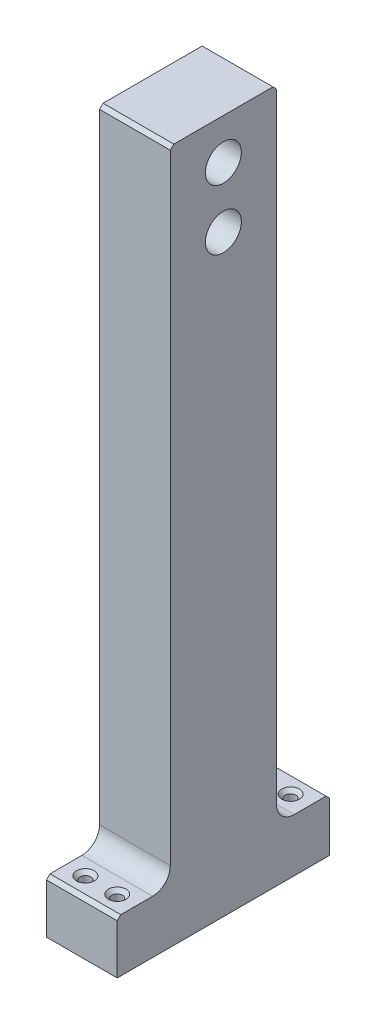
ISO-10303-21;
HEADER;
FILE_DESCRIPTION(('STEP AP214'),'2;1');
FILE_NAME('part.step','',(''),(''),'','','');
FILE_SCHEMA(('AUTOMOTIVE_DESIGN { 1 0 10303 214 1 1 1 1 }'));
ENDSEC;
DATA;
#1=APPLICATION_CONTEXT('core data for automotive mechanical design processes');
#2=APPLICATION_PROTOCOL_DEFINITION('international standard','automotive_design',2000,#1);
#3=PRODUCT_CONTEXT('',#1,'mechanical');
#4=PRODUCT('Part','Part','',(#3));
#5=PRODUCT_RELATED_PRODUCT_CATEGORY('part','',(#4));
#6=PRODUCT_DEFINITION_FORMATION('','',#4);
#7=PRODUCT_DEFINITION_CONTEXT('part definition',#1,'design');
#8=PRODUCT_DEFINITION('design','',#6,#7);
#9=PRODUCT_DEFINITION_SHAPE('','',#8);
#10=(LENGTH_UNIT() NAMED_UNIT(*) SI_UNIT(.MILLI.,.METRE.));
#11=(NAMED_UNIT(*) PLANE_ANGLE_UNIT() SI_UNIT($,.RADIAN.));
#12=(NAMED_UNIT(*) SI_UNIT($,.STERADIAN.) SOLID_ANGLE_UNIT());
#13=UNCERTAINTY_MEASURE_WITH_UNIT(LENGTH_MEASURE(1.E-05),#10,'distance_accuracy_value','');
#14=(GEOMETRIC_REPRESENTATION_CONTEXT(3) GLOBAL_UNCERTAINTY_ASSIGNED_CONTEXT((#13)) GLOBAL_UNIT_ASSIGNED_CONTEXT((#10,
#11,#12)) REPRESENTATION_CONTEXT('',''));
#15=CARTESIAN_POINT('',(0.,0.,0.));
#16=DIRECTION('',(0.,0.,1.));
#17=DIRECTION('',(1.,0.,0.));
#18=AXIS2_PLACEMENT_3D('',#15,#16,#17);
#19=CARTESIAN_POINT('',(20.,0.,0.));
#20=DIRECTION('',(-1.,0.,0.));
#21=DIRECTION('',(0.,0.,1.));
#22=AXIS2_PLACEMENT_3D('',#19,#20,#21);
#23=PLANE('',#22);
#24=DIRECTION('',(0.,-1.,0.));
#25=VECTOR('',#24,1.);
#26=CARTESIAN_POINT('',(20.,15.,-15.));
#27=LINE('',#26,#25);
#28=CARTESIAN_POINT('',(20.,195.075,-15.));
#29=VERTEX_POINT('',#28);
#30=CARTESIAN_POINT('',(20.,20.,-15.));
#31=VERTEX_POINT('',#30);
#32=EDGE_CURVE('E301',#29,#31,#27,.T.);
#33=ORIENTED_EDGE('',*,*,#32,.T.);
#34=CARTESIAN_POINT('',(20.,20.,-10.));
#35=DIRECTION('',(-1.,0.,0.));
#36=DIRECTION('',(0.,0.,1.));
#37=AXIS2_PLACEMENT_3D('',#34,#35,#36);
#38=CIRCLE('',#37,5.);
#39=CARTESIAN_POINT('',(20.,15.,-10.));
#40=VERTEX_POINT('',#39);
#41=EDGE_CURVE('E228',#31,#40,#38,.T.);
#42=ORIENTED_EDGE('',*,*,#41,.T.);
#43=DIRECTION('',(0.,0.,1.));
#44=VECTOR('',#43,1.);
#45=CARTESIAN_POINT('',(20.,15.,0.));
#46=LINE('',#45,#44);
#47=CARTESIAN_POINT('',(20.,15.,-1.));
#48=VERTEX_POINT('',#47);
#49=EDGE_CURVE('E175',#40,#48,#46,.T.);
#50=ORIENTED_EDGE('',*,*,#49,.T.);
#51=DIRECTION('',(0.,0.707106781186538,-0.707106781186557));
#52=VECTOR('',#51,1.);
#53=CARTESIAN_POINT('',(20.,14.,0.));
#54=LINE('',#53,#52);
#55=CARTESIAN_POINT('',(20.,14.,0.));
#56=VERTEX_POINT('',#55);
#57=EDGE_CURVE('E151',#48,#56,#54,.F.);
#58=ORIENTED_EDGE('',*,*,#57,.T.);
#59=DIRECTION('',(0.,-1.,0.));
#60=VECTOR('',#59,1.);
#61=CARTESIAN_POINT('',(20.,0.,0.));
#62=LINE('',#61,#60);
#63=CARTESIAN_POINT('',(20.,0.,0.));
#64=VERTEX_POINT('',#63);
#65=EDGE_CURVE('E144',#56,#64,#62,.T.);
#66=ORIENTED_EDGE('',*,*,#65,.T.);
#67=DIRECTION('',(0.,0.,-1.));
#68=VECTOR('',#67,1.);
#69=CARTESIAN_POINT('',(20.,0.,0.));
#70=LINE('',#69,#68);
#71=CARTESIAN_POINT('',(20.,0.,-60.));
#72=VERTEX_POINT('',#71);
#73=EDGE_CURVE('E148',#64,#72,#70,.T.);
#74=ORIENTED_EDGE('',*,*,#73,.T.);
#75=DIRECTION('',(0.,1.,0.));
#76=VECTOR('',#75,1.);
#77=CARTESIAN_POINT('',(20.,0.,-60.));
#78=LINE('',#77,#76);
#79=CARTESIAN_POINT('',(20.,14.0000000000001,-60.));
#80=VERTEX_POINT('',#79);
#81=EDGE_CURVE('E165',#72,#80,#78,.T.);
#82=ORIENTED_EDGE('',*,*,#81,.T.);
#83=DIRECTION('',(0.,-0.707106781186538,-0.707106781186557));
#84=VECTOR('',#83,1.);
#85=CARTESIAN_POINT('',(20.,15.,-59.));
#86=LINE('',#85,#84);
#87=CARTESIAN_POINT('',(20.,15.,-59.));
#88=VERTEX_POINT('',#87);
#89=EDGE_CURVE('E193',#80,#88,#86,.F.);
#90=ORIENTED_EDGE('',*,*,#89,.T.);
#91=DIRECTION('',(0.,0.,1.));
#92=VECTOR('',#91,1.);
#93=CARTESIAN_POINT('',(20.,15.,-45.));
#94=LINE('',#93,#92);
#95=CARTESIAN_POINT('',(20.,15.,-50.));
#96=VERTEX_POINT('',#95);
#97=EDGE_CURVE('E293',#88,#96,#94,.T.);
#98=ORIENTED_EDGE('',*,*,#97,.T.);
#99=CARTESIAN_POINT('',(20.,20.,-50.));
#100=DIRECTION('',(-1.,0.,0.));
#101=DIRECTION('',(0.,0.,1.));
#102=AXIS2_PLACEMENT_3D('',#99,#100,#101);
#103=CIRCLE('',#102,5.);
#104=CARTESIAN_POINT('',(20.,20.,-45.));
#105=VERTEX_POINT('',#104);
#106=EDGE_CURVE('E225',#96,#105,#103,.T.);
#107=ORIENTED_EDGE('',*,*,#106,.T.);
#108=DIRECTION('',(0.,1.,0.));
#109=VECTOR('',#108,1.);
#110=CARTESIAN_POINT('',(20.,196.075,-45.));
#111=LINE('',#110,#109);
#112=CARTESIAN_POINT('',(20.,195.075,-45.));
#113=VERTEX_POINT('',#112);
#114=EDGE_CURVE('E296',#105,#113,#111,.T.);
#115=ORIENTED_EDGE('',*,*,#114,.T.);
#116=DIRECTION('',(0.,-0.707106781186548,-0.707106781186548));
#117=VECTOR('',#116,1.);
#118=CARTESIAN_POINT('',(20.,196.075,-44.));
#119=LINE('',#118,#117);
#120=CARTESIAN_POINT('',(20.,196.075,-44.));
#121=VERTEX_POINT('',#120);
#122=EDGE_CURVE('E191',#113,#121,#119,.F.);
#123=ORIENTED_EDGE('',*,*,#122,.T.);
#124=DIRECTION('',(0.,0.,1.));
#125=VECTOR('',#124,1.);
#126=CARTESIAN_POINT('',(20.,196.075,-15.));
#127=LINE('',#126,#125);
#128=CARTESIAN_POINT('',(20.,196.075,-16.));
#129=VERTEX_POINT('',#128);
#130=EDGE_CURVE('E298',#121,#129,#127,.T.);
#131=ORIENTED_EDGE('',*,*,#130,.T.);
#132=DIRECTION('',(0.,0.707106781186549,-0.707106781186546));
#133=VECTOR('',#132,1.);
#134=CARTESIAN_POINT('',(20.,195.075,-15.));
#135=LINE('',#134,#133);
#136=EDGE_CURVE('E195',#129,#29,#135,.F.);
#137=ORIENTED_EDGE('',*,*,#136,.T.);
#138=EDGE_LOOP('',(#33,#42,#50,#58,#66,#74,#82,#90,#98,#107,#115,#123,#131,#137));
#139=FACE_BOUND('',#138,.T.);
#140=CARTESIAN_POINT('',(20.,184.575,-30.));
#141=DIRECTION('',(1.,0.,0.));
#142=DIRECTION('',(0.,0.,-1.));
#143=AXIS2_PLACEMENT_3D('',#140,#141,#142);
#144=CIRCLE('',#143,5.07500000000001);
#145=CARTESIAN_POINT('',(20.,184.575,-35.075));
#146=VERTEX_POINT('',#145);
#147=EDGE_CURVE('E287',#146,#146,#144,.T.);
#148=ORIENTED_EDGE('',*,*,#147,.F.);
#149=EDGE_LOOP('',(#148));
#150=FACE_BOUND('',#149,.T.);
#151=CARTESIAN_POINT('',(20.,167.575,-30.));
#152=DIRECTION('',(1.,0.,0.));
#153=DIRECTION('',(0.,0.,-1.));
#154=AXIS2_PLACEMENT_3D('',#151,#152,#153);
#155=CIRCLE('',#154,5.07500000000001);
#156=CARTESIAN_POINT('',(20.,167.575,-35.075));
#157=VERTEX_POINT('',#156);
#158=EDGE_CURVE('E281',#157,#157,#155,.T.);
#159=ORIENTED_EDGE('',*,*,#158,.F.);
#160=EDGE_LOOP('',(#159));
#161=FACE_BOUND('',#160,.T.);
#162=ADVANCED_FACE('F41',(#139,#150,#161),#23,.F.);
#163=CARTESIAN_POINT('',(0.,0.,0.));
#164=DIRECTION('',(-1.,0.,0.));
#165=DIRECTION('',(0.,0.,1.));
#166=AXIS2_PLACEMENT_3D('',#163,#164,#165);
#167=PLANE('',#166);
#168=CARTESIAN_POINT('',(0.,184.575,-30.));
#169=DIRECTION('',(1.,0.,0.));
#170=DIRECTION('',(0.,0.,-1.));
#171=AXIS2_PLACEMENT_3D('',#168,#169,#170);
#172=CIRCLE('',#171,5.07500000000001);
#173=CARTESIAN_POINT('',(0.,184.575,-35.075));
#174=VERTEX_POINT('',#173);
#175=EDGE_CURVE('E284',#174,#174,#172,.T.);
#176=ORIENTED_EDGE('',*,*,#175,.T.);
#177=EDGE_LOOP('',(#176));
#178=FACE_BOUND('',#177,.T.);
#179=DIRECTION('',(0.,-1.,0.));
#180=VECTOR('',#179,1.);
#181=CARTESIAN_POINT('',(0.,0.,0.));
#182=LINE('',#181,#180);
#183=CARTESIAN_POINT('',(0.,14.,0.));
#184=VERTEX_POINT('',#183);
#185=CARTESIAN_POINT('',(0.,0.,0.));
#186=VERTEX_POINT('',#185);
#187=EDGE_CURVE('E169',#184,#186,#182,.T.);
#188=ORIENTED_EDGE('',*,*,#187,.F.);
#189=DIRECTION('',(0.,-0.707106781186538,0.707106781186557));
#190=VECTOR('',#189,1.);
#191=CARTESIAN_POINT('',(0.,7.00000000000021,7.00000000000001));
#192=LINE('',#191,#190);
#193=CARTESIAN_POINT('',(0.,15.,-1.));
#194=VERTEX_POINT('',#193);
#195=EDGE_CURVE('E185',#184,#194,#192,.F.);
#196=ORIENTED_EDGE('',*,*,#195,.T.);
#197=DIRECTION('',(0.,0.,1.));
#198=VECTOR('',#197,1.);
#199=CARTESIAN_POINT('',(0.,15.,0.));
#200=LINE('',#199,#198);
#201=CARTESIAN_POINT('',(0.,15.,-10.));
#202=VERTEX_POINT('',#201);
#203=EDGE_CURVE('E156',#202,#194,#200,.T.);
#204=ORIENTED_EDGE('',*,*,#203,.F.);
#205=CARTESIAN_POINT('',(0.,20.,-10.));
#206=DIRECTION('',(-1.,0.,0.));
#207=DIRECTION('',(0.,0.,1.));
#208=AXIS2_PLACEMENT_3D('',#205,#206,#207);
#209=CIRCLE('',#208,5.);
#210=CARTESIAN_POINT('',(0.,20.,-15.));
#211=VERTEX_POINT('',#210);
#212=EDGE_CURVE('E57',#202,#211,#209,.F.);
#213=ORIENTED_EDGE('',*,*,#212,.T.);
#214=DIRECTION('',(0.,-1.,0.));
#215=VECTOR('',#214,1.);
#216=CARTESIAN_POINT('',(0.,15.,-15.));
#217=LINE('',#216,#215);
#218=CARTESIAN_POINT('',(0.,195.075,-15.));
#219=VERTEX_POINT('',#218);
#220=EDGE_CURVE('E318',#219,#211,#217,.T.);
#221=ORIENTED_EDGE('',*,*,#220,.F.);
#222=DIRECTION('',(0.,-0.707106781186549,0.707106781186546));
#223=VECTOR('',#222,1.);
#224=CARTESIAN_POINT('',(0.,90.0374999999995,90.0374999999999));
#225=LINE('',#224,#223);
#226=CARTESIAN_POINT('',(0.,196.075,-16.));
#227=VERTEX_POINT('',#226);
#228=EDGE_CURVE('E183',#219,#227,#225,.F.);
#229=ORIENTED_EDGE('',*,*,#228,.T.);
#230=DIRECTION('',(0.,0.,1.));
#231=VECTOR('',#230,1.);
#232=CARTESIAN_POINT('',(0.,196.075,-15.));
#233=LINE('',#232,#231);
#234=CARTESIAN_POINT('',(0.,196.075,-44.));
#235=VERTEX_POINT('',#234);
#236=EDGE_CURVE('E315',#235,#227,#233,.T.);
#237=ORIENTED_EDGE('',*,*,#236,.F.);
#238=DIRECTION('',(0.,0.707106781186548,0.707106781186548));
#239=VECTOR('',#238,1.);
#240=CARTESIAN_POINT('',(0.,120.0375,-120.0375));
#241=LINE('',#240,#239);
#242=CARTESIAN_POINT('',(0.,195.075,-45.));
#243=VERTEX_POINT('',#242);
#244=EDGE_CURVE('E173',#235,#243,#241,.F.);
#245=ORIENTED_EDGE('',*,*,#244,.T.);
#246=DIRECTION('',(0.,1.,0.));
#247=VECTOR('',#246,1.);
#248=CARTESIAN_POINT('',(0.,196.075,-45.));
#249=LINE('',#248,#247);
#250=CARTESIAN_POINT('',(0.,20.,-45.));
#251=VERTEX_POINT('',#250);
#252=EDGE_CURVE('E313',#251,#243,#249,.T.);
#253=ORIENTED_EDGE('',*,*,#252,.F.);
#254=CARTESIAN_POINT('',(0.,20.,-50.));
#255=DIRECTION('',(-1.,0.,0.));
#256=DIRECTION('',(0.,0.,1.));
#257=AXIS2_PLACEMENT_3D('',#254,#255,#256);
#258=CIRCLE('',#257,5.);
#259=CARTESIAN_POINT('',(0.,15.,-50.));
#260=VERTEX_POINT('',#259);
#261=EDGE_CURVE('E223',#251,#260,#258,.F.);
#262=ORIENTED_EDGE('',*,*,#261,.T.);
#263=DIRECTION('',(0.,0.,1.));
#264=VECTOR('',#263,1.);
#265=CARTESIAN_POINT('',(0.,15.,-45.));
#266=LINE('',#265,#264);
#267=CARTESIAN_POINT('',(0.,15.,-59.));
#268=VERTEX_POINT('',#267);
#269=EDGE_CURVE('E310',#268,#260,#266,.T.);
#270=ORIENTED_EDGE('',*,*,#269,.F.);
#271=DIRECTION('',(0.,0.707106781186538,0.707106781186557));
#272=VECTOR('',#271,1.);
#273=CARTESIAN_POINT('',(0.,37.0000000000002,-36.9999999999992));
#274=LINE('',#273,#272);
#275=CARTESIAN_POINT('',(0.,14.0000000000001,-60.));
#276=VERTEX_POINT('',#275);
#277=EDGE_CURVE('E181',#268,#276,#274,.F.);
#278=ORIENTED_EDGE('',*,*,#277,.T.);
#279=DIRECTION('',(0.,1.,0.));
#280=VECTOR('',#279,1.);
#281=CARTESIAN_POINT('',(0.,0.,-60.));
#282=LINE('',#281,#280);
#283=CARTESIAN_POINT('',(0.,0.,-60.));
#284=VERTEX_POINT('',#283);
#285=EDGE_CURVE('E307',#284,#276,#282,.T.);
#286=ORIENTED_EDGE('',*,*,#285,.F.);
#287=DIRECTION('',(0.,0.,-1.));
#288=VECTOR('',#287,1.);
#289=CARTESIAN_POINT('',(0.,0.,0.));
#290=LINE('',#289,#288);
#291=EDGE_CURVE('E305',#186,#284,#290,.T.);
#292=ORIENTED_EDGE('',*,*,#291,.F.);
#293=EDGE_LOOP('',(#188,#196,#204,#213,#221,#229,#237,#245,#253,#262,#270,#278,#286,#292));
#294=FACE_BOUND('',#293,.T.);
#295=CARTESIAN_POINT('',(0.,167.575,-30.));
#296=DIRECTION('',(1.,0.,0.));
#297=DIRECTION('',(0.,0.,-1.));
#298=AXIS2_PLACEMENT_3D('',#295,#296,#297);
#299=CIRCLE('',#298,5.07500000000001);
#300=CARTESIAN_POINT('',(0.,167.575,-35.075));
#301=VERTEX_POINT('',#300);
#302=EDGE_CURVE('E280',#301,#301,#299,.T.);
#303=ORIENTED_EDGE('',*,*,#302,.T.);
#304=EDGE_LOOP('',(#303));
#305=FACE_BOUND('',#304,.T.);
#306=ADVANCED_FACE('F323',(#178,#294,#305),#167,.T.);
#307=CARTESIAN_POINT('',(20.,0.,0.));
#308=DIRECTION('',(0.,0.,-1.));
#309=DIRECTION('',(-1.,0.,0.));
#310=AXIS2_PLACEMENT_3D('',#307,#308,#309);
#311=PLANE('',#310);
#312=ORIENTED_EDGE('',*,*,#65,.F.);
#313=DIRECTION('',(-1.,0.,0.));
#314=VECTOR('',#313,1.);
#315=CARTESIAN_POINT('',(20.,14.,0.));
#316=LINE('',#315,#314);
#317=EDGE_CURVE('E171',#56,#184,#316,.T.);
#318=ORIENTED_EDGE('',*,*,#317,.T.);
#319=ORIENTED_EDGE('',*,*,#187,.T.);
#320=DIRECTION('',(-1.,0.,0.));
#321=VECTOR('',#320,1.);
#322=CARTESIAN_POINT('',(20.,0.,0.));
#323=LINE('',#322,#321);
#324=EDGE_CURVE('E161',#64,#186,#323,.T.);
#325=ORIENTED_EDGE('',*,*,#324,.F.);
#326=EDGE_LOOP('',(#312,#318,#319,#325));
#327=FACE_BOUND('',#326,.T.);
#328=ADVANCED_FACE('F167',(#327),#311,.F.);
#329=CARTESIAN_POINT('',(20.,0.,0.));
#330=DIRECTION('',(0.,1.,0.));
#331=DIRECTION('',(0.,0.,1.));
#332=AXIS2_PLACEMENT_3D('',#329,#330,#331);
#333=PLANE('',#332);
#334=CARTESIAN_POINT('',(14.5,0.,-54.5));
#335=DIRECTION('',(0.,1.,0.));
#336=DIRECTION('',(0.,0.,1.));
#337=AXIS2_PLACEMENT_3D('',#334,#335,#336);
#338=CIRCLE('',#337,1.5);
#339=CARTESIAN_POINT('',(14.5,0.,-53.));
#340=VERTEX_POINT('',#339);
#341=EDGE_CURVE('E269',#340,#340,#338,.T.);
#342=ORIENTED_EDGE('',*,*,#341,.T.);
#343=EDGE_LOOP('',(#342));
#344=FACE_BOUND('',#343,.T.);
#345=CARTESIAN_POINT('',(5.5,0.,-5.50000000000003));
#346=DIRECTION('',(0.,1.,0.));
#347=DIRECTION('',(0.,0.,1.));
#348=AXIS2_PLACEMENT_3D('',#345,#346,#347);
#349=CIRCLE('',#348,1.5);
#350=CARTESIAN_POINT('',(5.5,0.,-4.00000000000002));
#351=VERTEX_POINT('',#350);
#352=EDGE_CURVE('E267',#351,#351,#349,.T.);
#353=ORIENTED_EDGE('',*,*,#352,.T.);
#354=EDGE_LOOP('',(#353));
#355=FACE_BOUND('',#354,.T.);
#356=CARTESIAN_POINT('',(14.5,0.,-5.50000000000003));
#357=DIRECTION('',(0.,1.,0.));
#358=DIRECTION('',(0.,0.,1.));
#359=AXIS2_PLACEMENT_3D('',#356,#357,#358);
#360=CIRCLE('',#359,1.5);
#361=CARTESIAN_POINT('',(14.5,0.,-4.00000000000002));
#362=VERTEX_POINT('',#361);
#363=EDGE_CURVE('E270',#362,#362,#360,.T.);
#364=ORIENTED_EDGE('',*,*,#363,.T.);
#365=EDGE_LOOP('',(#364));
#366=FACE_BOUND('',#365,.T.);
#367=CARTESIAN_POINT('',(5.5,0.,-54.5));
#368=DIRECTION('',(0.,1.,0.));
#369=DIRECTION('',(0.,0.,1.));
#370=AXIS2_PLACEMENT_3D('',#367,#368,#369);
#371=CIRCLE('',#370,1.5);
#372=CARTESIAN_POINT('',(5.5,0.,-53.));
#373=VERTEX_POINT('',#372);
#374=EDGE_CURVE('E273',#373,#373,#371,.T.);
#375=ORIENTED_EDGE('',*,*,#374,.T.);
#376=EDGE_LOOP('',(#375));
#377=FACE_BOUND('',#376,.T.);
#378=ORIENTED_EDGE('',*,*,#291,.T.);
#379=DIRECTION('',(-1.,0.,0.));
#380=VECTOR('',#379,1.);
#381=CARTESIAN_POINT('',(20.,0.,-60.));
#382=LINE('',#381,#380);
#383=EDGE_CURVE('E163',#72,#284,#382,.T.);
#384=ORIENTED_EDGE('',*,*,#383,.F.);
#385=ORIENTED_EDGE('',*,*,#73,.F.);
#386=ORIENTED_EDGE('',*,*,#324,.T.);
#387=EDGE_LOOP('',(#378,#384,#385,#386));
#388=FACE_BOUND('',#387,.T.);
#389=ADVANCED_FACE('F160',(#344,#355,#366,#377,#388),#333,.F.);
#390=CARTESIAN_POINT('',(20.,0.,-60.));
#391=DIRECTION('',(0.,0.,1.));
#392=DIRECTION('',(1.,0.,0.));
#393=AXIS2_PLACEMENT_3D('',#390,#391,#392);
#394=PLANE('',#393);
#395=ORIENTED_EDGE('',*,*,#285,.T.);
#396=DIRECTION('',(1.,0.,0.));
#397=VECTOR('',#396,1.);
#398=CARTESIAN_POINT('',(20.,14.0000000000001,-60.));
#399=LINE('',#398,#397);
#400=EDGE_CURVE('E209',#276,#80,#399,.T.);
#401=ORIENTED_EDGE('',*,*,#400,.T.);
#402=ORIENTED_EDGE('',*,*,#81,.F.);
#403=ORIENTED_EDGE('',*,*,#383,.T.);
#404=EDGE_LOOP('',(#395,#401,#402,#403));
#405=FACE_BOUND('',#404,.T.);
#406=ADVANCED_FACE('F368',(#405),#394,.F.);
#407=CARTESIAN_POINT('',(20.,15.,-45.));
#408=DIRECTION('',(0.,-1.,0.));
#409=DIRECTION('',(0.,0.,-1.));
#410=AXIS2_PLACEMENT_3D('',#407,#408,#409);
#411=PLANE('',#410);
#412=CARTESIAN_POINT('',(5.5,15.,-54.5));
#413=DIRECTION('',(0.,-1.,0.));
#414=DIRECTION('',(0.,0.,-1.));
#415=AXIS2_PLACEMENT_3D('',#412,#413,#414);
#416=CIRCLE('',#415,2.5);
#417=CARTESIAN_POINT('',(5.5,15.,-57.));
#418=VERTEX_POINT('',#417);
#419=EDGE_CURVE('E236',#418,#418,#416,.T.);
#420=ORIENTED_EDGE('',*,*,#419,.T.);
#421=EDGE_LOOP('',(#420));
#422=FACE_BOUND('',#421,.T.);
#423=CARTESIAN_POINT('',(14.5,15.,-54.5));
#424=DIRECTION('',(0.,-1.,0.));
#425=DIRECTION('',(0.,0.,-1.));
#426=AXIS2_PLACEMENT_3D('',#423,#424,#425);
#427=CIRCLE('',#426,2.5);
#428=CARTESIAN_POINT('',(14.5,15.,-57.));
#429=VERTEX_POINT('',#428);
#430=EDGE_CURVE('E233',#429,#429,#427,.T.);
#431=ORIENTED_EDGE('',*,*,#430,.T.);
#432=EDGE_LOOP('',(#431));
#433=FACE_BOUND('',#432,.T.);
#434=ORIENTED_EDGE('',*,*,#269,.T.);
#435=DIRECTION('',(-1.,0.,0.));
#436=VECTOR('',#435,1.);
#437=CARTESIAN_POINT('',(20.,15.,-50.));
#438=LINE('',#437,#436);
#439=EDGE_CURVE('E217',#260,#96,#438,.F.);
#440=ORIENTED_EDGE('',*,*,#439,.T.);
#441=ORIENTED_EDGE('',*,*,#97,.F.);
#442=DIRECTION('',(-1.,0.,0.));
#443=VECTOR('',#442,1.);
#444=CARTESIAN_POINT('',(20.,15.,-59.));
#445=LINE('',#444,#443);
#446=EDGE_CURVE('E206',#88,#268,#445,.T.);
#447=ORIENTED_EDGE('',*,*,#446,.T.);
#448=EDGE_LOOP('',(#434,#440,#441,#447));
#449=FACE_BOUND('',#448,.T.);
#450=ADVANCED_FACE('F364',(#422,#433,#449),#411,.F.);
#451=CARTESIAN_POINT('',(20.,196.075,-45.));
#452=DIRECTION('',(0.,0.,1.));
#453=DIRECTION('',(0.,-1.,0.));
#454=AXIS2_PLACEMENT_3D('',#451,#452,#453);
#455=PLANE('',#454);
#456=ORIENTED_EDGE('',*,*,#114,.F.);
#457=DIRECTION('',(-1.,0.,0.));
#458=VECTOR('',#457,1.);
#459=CARTESIAN_POINT('',(0.,20.,-45.));
#460=LINE('',#459,#458);
#461=EDGE_CURVE('E214',#105,#251,#460,.T.);
#462=ORIENTED_EDGE('',*,*,#461,.T.);
#463=ORIENTED_EDGE('',*,*,#252,.T.);
#464=DIRECTION('',(1.,0.,0.));
#465=VECTOR('',#464,1.);
#466=CARTESIAN_POINT('',(20.,195.075,-45.));
#467=LINE('',#466,#465);
#468=EDGE_CURVE('E211',#243,#113,#467,.T.);
#469=ORIENTED_EDGE('',*,*,#468,.T.);
#470=EDGE_LOOP('',(#456,#462,#463,#469));
#471=FACE_BOUND('',#470,.T.);
#472=ADVANCED_FACE('F360',(#471),#455,.F.);
#473=CARTESIAN_POINT('',(20.,196.075,-15.));
#474=DIRECTION('',(0.,-1.,0.));
#475=DIRECTION('',(0.,0.,-1.));
#476=AXIS2_PLACEMENT_3D('',#473,#474,#475);
#477=PLANE('',#476);
#478=ORIENTED_EDGE('',*,*,#236,.T.);
#479=DIRECTION('',(1.,0.,0.));
#480=VECTOR('',#479,1.);
#481=CARTESIAN_POINT('',(20.,196.075,-16.));
#482=LINE('',#481,#480);
#483=EDGE_CURVE('E204',#227,#129,#482,.T.);
#484=ORIENTED_EDGE('',*,*,#483,.T.);
#485=ORIENTED_EDGE('',*,*,#130,.F.);
#486=DIRECTION('',(-1.,0.,0.));
#487=VECTOR('',#486,1.);
#488=CARTESIAN_POINT('',(20.,196.075,-44.));
#489=LINE('',#488,#487);
#490=EDGE_CURVE('E201',#121,#235,#489,.T.);
#491=ORIENTED_EDGE('',*,*,#490,.T.);
#492=EDGE_LOOP('',(#478,#484,#485,#491));
#493=FACE_BOUND('',#492,.T.);
#494=ADVANCED_FACE('F357',(#493),#477,.F.);
#495=CARTESIAN_POINT('',(20.,15.,-15.));
#496=DIRECTION('',(0.,0.,-1.));
#497=DIRECTION('',(0.,1.,0.));
#498=AXIS2_PLACEMENT_3D('',#495,#496,#497);
#499=PLANE('',#498);
#500=ORIENTED_EDGE('',*,*,#220,.T.);
#501=DIRECTION('',(-1.,0.,0.));
#502=VECTOR('',#501,1.);
#503=CARTESIAN_POINT('',(20.,20.,-15.));
#504=LINE('',#503,#502);
#505=EDGE_CURVE('E64',#211,#31,#504,.F.);
#506=ORIENTED_EDGE('',*,*,#505,.T.);
#507=ORIENTED_EDGE('',*,*,#32,.F.);
#508=DIRECTION('',(-1.,0.,0.));
#509=VECTOR('',#508,1.);
#510=CARTESIAN_POINT('',(20.,195.075,-15.));
#511=LINE('',#510,#509);
#512=EDGE_CURVE('E198',#29,#219,#511,.T.);
#513=ORIENTED_EDGE('',*,*,#512,.T.);
#514=EDGE_LOOP('',(#500,#506,#507,#513));
#515=FACE_BOUND('',#514,.T.);
#516=ADVANCED_FACE('F354',(#515),#499,.F.);
#517=CARTESIAN_POINT('',(20.,15.,0.));
#518=DIRECTION('',(0.,-1.,0.));
#519=DIRECTION('',(0.,0.,-1.));
#520=AXIS2_PLACEMENT_3D('',#517,#518,#519);
#521=PLANE('',#520);
#522=CARTESIAN_POINT('',(5.5,15.,-5.50000000000003));
#523=DIRECTION('',(0.,-1.,0.));
#524=DIRECTION('',(0.,0.,-1.));
#525=AXIS2_PLACEMENT_3D('',#522,#523,#524);
#526=CIRCLE('',#525,2.5);
#527=CARTESIAN_POINT('',(5.5,15.,-8.00000000000003));
#528=VERTEX_POINT('',#527);
#529=EDGE_CURVE('E50',#528,#528,#526,.T.);
#530=ORIENTED_EDGE('',*,*,#529,.T.);
#531=EDGE_LOOP('',(#530));
#532=FACE_BOUND('',#531,.T.);
#533=CARTESIAN_POINT('',(14.5,15.,-5.50000000000003));
#534=DIRECTION('',(0.,-1.,0.));
#535=DIRECTION('',(0.,0.,-1.));
#536=AXIS2_PLACEMENT_3D('',#533,#534,#535);
#537=CIRCLE('',#536,2.5);
#538=CARTESIAN_POINT('',(14.5,15.,-8.00000000000003));
#539=VERTEX_POINT('',#538);
#540=EDGE_CURVE('E245',#539,#539,#537,.T.);
#541=ORIENTED_EDGE('',*,*,#540,.T.);
#542=EDGE_LOOP('',(#541));
#543=FACE_BOUND('',#542,.T.);
#544=ORIENTED_EDGE('',*,*,#49,.F.);
#545=DIRECTION('',(-1.,0.,0.));
#546=VECTOR('',#545,1.);
#547=CARTESIAN_POINT('',(0.,15.,-10.));
#548=LINE('',#547,#546);
#549=EDGE_CURVE('E219',#40,#202,#548,.T.);
#550=ORIENTED_EDGE('',*,*,#549,.T.);
#551=ORIENTED_EDGE('',*,*,#203,.T.);
#552=DIRECTION('',(1.,0.,0.));
#553=VECTOR('',#552,1.);
#554=CARTESIAN_POINT('',(20.,15.,-1.));
#555=LINE('',#554,#553);
#556=EDGE_CURVE('E188',#194,#48,#555,.T.);
#557=ORIENTED_EDGE('',*,*,#556,.T.);
#558=EDGE_LOOP('',(#544,#550,#551,#557));
#559=FACE_BOUND('',#558,.T.);
#560=ADVANCED_FACE('F250',(#532,#543,#559),#521,.F.);
#561=CARTESIAN_POINT('',(20.,184.575,-30.));
#562=DIRECTION('',(-1.,0.,0.));
#563=DIRECTION('',(0.,0.,1.));
#564=AXIS2_PLACEMENT_3D('',#561,#562,#563);
#565=CYLINDRICAL_SURFACE('',#564,5.07500000000001);
#566=ORIENTED_EDGE('',*,*,#147,.T.);
#567=EDGE_LOOP('',(#566));
#568=FACE_BOUND('',#567,.T.);
#569=ORIENTED_EDGE('',*,*,#175,.F.);
#570=EDGE_LOOP('',(#569));
#571=FACE_BOUND('',#570,.T.);
#572=ADVANCED_FACE('F338',(#568,#571),#565,.F.);
#573=CARTESIAN_POINT('',(20.,167.575,-30.));
#574=DIRECTION('',(-1.,0.,0.));
#575=DIRECTION('',(0.,0.,1.));
#576=AXIS2_PLACEMENT_3D('',#573,#574,#575);
#577=CYLINDRICAL_SURFACE('',#576,5.07500000000001);
#578=ORIENTED_EDGE('',*,*,#158,.T.);
#579=EDGE_LOOP('',(#578));
#580=FACE_BOUND('',#579,.T.);
#581=ORIENTED_EDGE('',*,*,#302,.F.);
#582=EDGE_LOOP('',(#581));
#583=FACE_BOUND('',#582,.T.);
#584=ADVANCED_FACE('F329',(#580,#583),#577,.F.);
#585=CARTESIAN_POINT('',(20.,14.,0.));
#586=DIRECTION('',(0.,-0.707106781186557,-0.707106781186538));
#587=DIRECTION('',(-1.,0.,0.));
#588=AXIS2_PLACEMENT_3D('',#585,#586,#587);
#589=PLANE('',#588);
#590=ORIENTED_EDGE('',*,*,#57,.F.);
#591=ORIENTED_EDGE('',*,*,#556,.F.);
#592=ORIENTED_EDGE('',*,*,#195,.F.);
#593=ORIENTED_EDGE('',*,*,#317,.F.);
#594=EDGE_LOOP('',(#590,#591,#592,#593));
#595=FACE_BOUND('',#594,.T.);
#596=ADVANCED_FACE('F326',(#595),#589,.F.);
#597=CARTESIAN_POINT('',(20.,195.075,-15.));
#598=DIRECTION('',(0.,-0.707106781186546,-0.707106781186549));
#599=DIRECTION('',(-1.,0.,0.));
#600=AXIS2_PLACEMENT_3D('',#597,#598,#599);
#601=PLANE('',#600);
#602=ORIENTED_EDGE('',*,*,#136,.F.);
#603=ORIENTED_EDGE('',*,*,#483,.F.);
#604=ORIENTED_EDGE('',*,*,#228,.F.);
#605=ORIENTED_EDGE('',*,*,#512,.F.);
#606=EDGE_LOOP('',(#602,#603,#604,#605));
#607=FACE_BOUND('',#606,.T.);
#608=ADVANCED_FACE('F328',(#607),#601,.F.);
#609=CARTESIAN_POINT('',(20.,15.,-59.));
#610=DIRECTION('',(0.,-0.707106781186557,0.707106781186538));
#611=DIRECTION('',(-1.,0.,0.));
#612=AXIS2_PLACEMENT_3D('',#609,#610,#611);
#613=PLANE('',#612);
#614=ORIENTED_EDGE('',*,*,#89,.F.);
#615=ORIENTED_EDGE('',*,*,#400,.F.);
#616=ORIENTED_EDGE('',*,*,#277,.F.);
#617=ORIENTED_EDGE('',*,*,#446,.F.);
#618=EDGE_LOOP('',(#614,#615,#616,#617));
#619=FACE_BOUND('',#618,.T.);
#620=ADVANCED_FACE('F335',(#619),#613,.F.);
#621=CARTESIAN_POINT('',(20.,196.075,-44.));
#622=DIRECTION('',(0.,-0.707106781186547,0.707106781186547));
#623=DIRECTION('',(-1.,0.,0.));
#624=AXIS2_PLACEMENT_3D('',#621,#622,#623);
#625=PLANE('',#624);
#626=ORIENTED_EDGE('',*,*,#122,.F.);
#627=ORIENTED_EDGE('',*,*,#468,.F.);
#628=ORIENTED_EDGE('',*,*,#244,.F.);
#629=ORIENTED_EDGE('',*,*,#490,.F.);
#630=EDGE_LOOP('',(#626,#627,#628,#629));
#631=FACE_BOUND('',#630,.T.);
#632=ADVANCED_FACE('F450',(#631),#625,.F.);
#633=CARTESIAN_POINT('',(20.,20.,-50.));
#634=DIRECTION('',(1.,0.,0.));
#635=DIRECTION('',(0.,0.,-1.));
#636=AXIS2_PLACEMENT_3D('',#633,#634,#635);
#637=CYLINDRICAL_SURFACE('',#636,5.);
#638=ORIENTED_EDGE('',*,*,#106,.F.);
#639=ORIENTED_EDGE('',*,*,#439,.F.);
#640=ORIENTED_EDGE('',*,*,#261,.F.);
#641=ORIENTED_EDGE('',*,*,#461,.F.);
#642=EDGE_LOOP('',(#638,#639,#640,#641));
#643=FACE_BOUND('',#642,.T.);
#644=ADVANCED_FACE('F461',(#643),#637,.F.);
#645=CARTESIAN_POINT('',(20.,20.,-10.));
#646=DIRECTION('',(1.,0.,0.));
#647=DIRECTION('',(0.,0.,-1.));
#648=AXIS2_PLACEMENT_3D('',#645,#646,#647);
#649=CYLINDRICAL_SURFACE('',#648,5.);
#650=ORIENTED_EDGE('',*,*,#41,.F.);
#651=ORIENTED_EDGE('',*,*,#505,.F.);
#652=ORIENTED_EDGE('',*,*,#212,.F.);
#653=ORIENTED_EDGE('',*,*,#549,.F.);
#654=EDGE_LOOP('',(#650,#651,#652,#653));
#655=FACE_BOUND('',#654,.T.);
#656=ADVANCED_FACE('F471',(#655),#649,.F.);
#657=CARTESIAN_POINT('',(14.5,0.,-5.50000000000003));
#658=DIRECTION('',(0.,1.,0.));
#659=DIRECTION('',(0.,0.,1.));
#660=AXIS2_PLACEMENT_3D('',#657,#658,#659);
#661=CYLINDRICAL_SURFACE('',#660,1.5);
#662=CARTESIAN_POINT('',(14.5,14.,-5.50000000000003));
#663=DIRECTION('',(0.,-1.,0.));
#664=DIRECTION('',(0.,0.,-1.));
#665=AXIS2_PLACEMENT_3D('',#662,#663,#664);
#666=CIRCLE('',#665,1.5);
#667=CARTESIAN_POINT('',(14.5,14.,-7.00000000000003));
#668=VERTEX_POINT('',#667);
#669=EDGE_CURVE('E11',#668,#668,#666,.F.);
#670=ORIENTED_EDGE('',*,*,#669,.T.);
#671=EDGE_LOOP('',(#670));
#672=FACE_BOUND('',#671,.T.);
#673=ORIENTED_EDGE('',*,*,#363,.F.);
#674=EDGE_LOOP('',(#673));
#675=FACE_BOUND('',#674,.T.);
#676=ADVANCED_FACE('F263',(#672,#675),#661,.F.);
#677=CARTESIAN_POINT('',(5.5,0.,-5.50000000000003));
#678=DIRECTION('',(0.,1.,0.));
#679=DIRECTION('',(0.,0.,1.));
#680=AXIS2_PLACEMENT_3D('',#677,#678,#679);
#681=CYLINDRICAL_SURFACE('',#680,1.5);
#682=CARTESIAN_POINT('',(5.5,14.,-5.50000000000003));
#683=DIRECTION('',(0.,-1.,0.));
#684=DIRECTION('',(0.,0.,-1.));
#685=AXIS2_PLACEMENT_3D('',#682,#683,#684);
#686=CIRCLE('',#685,1.5);
#687=CARTESIAN_POINT('',(5.5,14.,-7.00000000000003));
#688=VERTEX_POINT('',#687);
#689=EDGE_CURVE('E242',#688,#688,#686,.F.);
#690=ORIENTED_EDGE('',*,*,#689,.T.);
#691=EDGE_LOOP('',(#690));
#692=FACE_BOUND('',#691,.T.);
#693=ORIENTED_EDGE('',*,*,#352,.F.);
#694=EDGE_LOOP('',(#693));
#695=FACE_BOUND('',#694,.T.);
#696=ADVANCED_FACE('F259',(#692,#695),#681,.F.);
#697=CARTESIAN_POINT('',(5.5,0.,-54.5));
#698=DIRECTION('',(0.,1.,0.));
#699=DIRECTION('',(0.,0.,1.));
#700=AXIS2_PLACEMENT_3D('',#697,#698,#699);
#701=CYLINDRICAL_SURFACE('',#700,1.5);
#702=CARTESIAN_POINT('',(5.5,14.,-54.5));
#703=DIRECTION('',(0.,-1.,0.));
#704=DIRECTION('',(0.,0.,-1.));
#705=AXIS2_PLACEMENT_3D('',#702,#703,#704);
#706=CIRCLE('',#705,1.5);
#707=CARTESIAN_POINT('',(5.5,14.,-56.));
#708=VERTEX_POINT('',#707);
#709=EDGE_CURVE('E230',#708,#708,#706,.F.);
#710=ORIENTED_EDGE('',*,*,#709,.T.);
#711=EDGE_LOOP('',(#710));
#712=FACE_BOUND('',#711,.T.);
#713=ORIENTED_EDGE('',*,*,#374,.F.);
#714=EDGE_LOOP('',(#713));
#715=FACE_BOUND('',#714,.T.);
#716=ADVANCED_FACE('F262',(#712,#715),#701,.F.);
#717=CARTESIAN_POINT('',(14.5,0.,-54.5));
#718=DIRECTION('',(0.,1.,0.));
#719=DIRECTION('',(0.,0.,1.));
#720=AXIS2_PLACEMENT_3D('',#717,#718,#719);
#721=CYLINDRICAL_SURFACE('',#720,1.5);
#722=CARTESIAN_POINT('',(14.5,14.,-54.5));
#723=DIRECTION('',(0.,-1.,0.));
#724=DIRECTION('',(0.,0.,-1.));
#725=AXIS2_PLACEMENT_3D('',#722,#723,#724);
#726=CIRCLE('',#725,1.5);
#727=CARTESIAN_POINT('',(14.5,14.,-56.));
#728=VERTEX_POINT('',#727);
#729=EDGE_CURVE('E239',#728,#728,#726,.F.);
#730=ORIENTED_EDGE('',*,*,#729,.T.);
#731=EDGE_LOOP('',(#730));
#732=FACE_BOUND('',#731,.T.);
#733=ORIENTED_EDGE('',*,*,#341,.F.);
#734=EDGE_LOOP('',(#733));
#735=FACE_BOUND('',#734,.T.);
#736=ADVANCED_FACE('F507',(#732,#735),#721,.F.);
#737=CARTESIAN_POINT('',(5.5,14.,-54.5));
#738=DIRECTION('',(0.,1.,0.));
#739=DIRECTION('',(0.,0.,1.));
#740=AXIS2_PLACEMENT_3D('',#737,#738,#739);
#741=CONICAL_SURFACE('',#740,1.5,0.785398163397459);
#742=ORIENTED_EDGE('',*,*,#419,.F.);
#743=EDGE_LOOP('',(#742));
#744=FACE_BOUND('',#743,.T.);
#745=ORIENTED_EDGE('',*,*,#709,.F.);
#746=EDGE_LOOP('',(#745));
#747=FACE_BOUND('',#746,.T.);
#748=ADVANCED_FACE('F518',(#744,#747),#741,.F.);
#749=CARTESIAN_POINT('',(14.5,14.,-54.5));
#750=DIRECTION('',(0.,1.,0.));
#751=DIRECTION('',(0.,0.,1.));
#752=AXIS2_PLACEMENT_3D('',#749,#750,#751);
#753=CONICAL_SURFACE('',#752,1.5,0.785398163397459);
#754=ORIENTED_EDGE('',*,*,#430,.F.);
#755=EDGE_LOOP('',(#754));
#756=FACE_BOUND('',#755,.T.);
#757=ORIENTED_EDGE('',*,*,#729,.F.);
#758=EDGE_LOOP('',(#757));
#759=FACE_BOUND('',#758,.T.);
#760=ADVANCED_FACE('F256',(#756,#759),#753,.F.);
#761=CARTESIAN_POINT('',(5.5,14.,-5.50000000000003));
#762=DIRECTION('',(0.,1.,0.));
#763=DIRECTION('',(0.,0.,1.));
#764=AXIS2_PLACEMENT_3D('',#761,#762,#763);
#765=CONICAL_SURFACE('',#764,1.5,0.785398163397431);
#766=ORIENTED_EDGE('',*,*,#529,.F.);
#767=EDGE_LOOP('',(#766));
#768=FACE_BOUND('',#767,.T.);
#769=ORIENTED_EDGE('',*,*,#689,.F.);
#770=EDGE_LOOP('',(#769));
#771=FACE_BOUND('',#770,.T.);
#772=ADVANCED_FACE('F253',(#768,#771),#765,.F.);
#773=CARTESIAN_POINT('',(14.5,14.,-5.50000000000003));
#774=DIRECTION('',(0.,1.,0.));
#775=DIRECTION('',(0.,0.,1.));
#776=AXIS2_PLACEMENT_3D('',#773,#774,#775);
#777=CONICAL_SURFACE('',#776,1.5,0.785398163397431);
#778=ORIENTED_EDGE('',*,*,#540,.F.);
#779=EDGE_LOOP('',(#778));
#780=FACE_BOUND('',#779,.T.);
#781=ORIENTED_EDGE('',*,*,#669,.F.);
#782=EDGE_LOOP('',(#781));
#783=FACE_BOUND('',#782,.T.);
#784=ADVANCED_FACE('F44',(#780,#783),#777,.F.);
#785=CLOSED_SHELL('',(#162,#306,#328,#389,#406,#450,#472,#494,#516,#560,#572,#584,#596,#608,
#620,#632,#644,#656,#676,#696,#716,#736,#748,#760,#772,#784));
#786=MANIFOLD_SOLID_BREP('B2',#785);
#787=ADVANCED_BREP_SHAPE_REPRESENTATION('',(#18,#786),#14);
#788=SHAPE_DEFINITION_REPRESENTATION(#9,#787);
ENDSEC;
END-ISO-10303-21;
